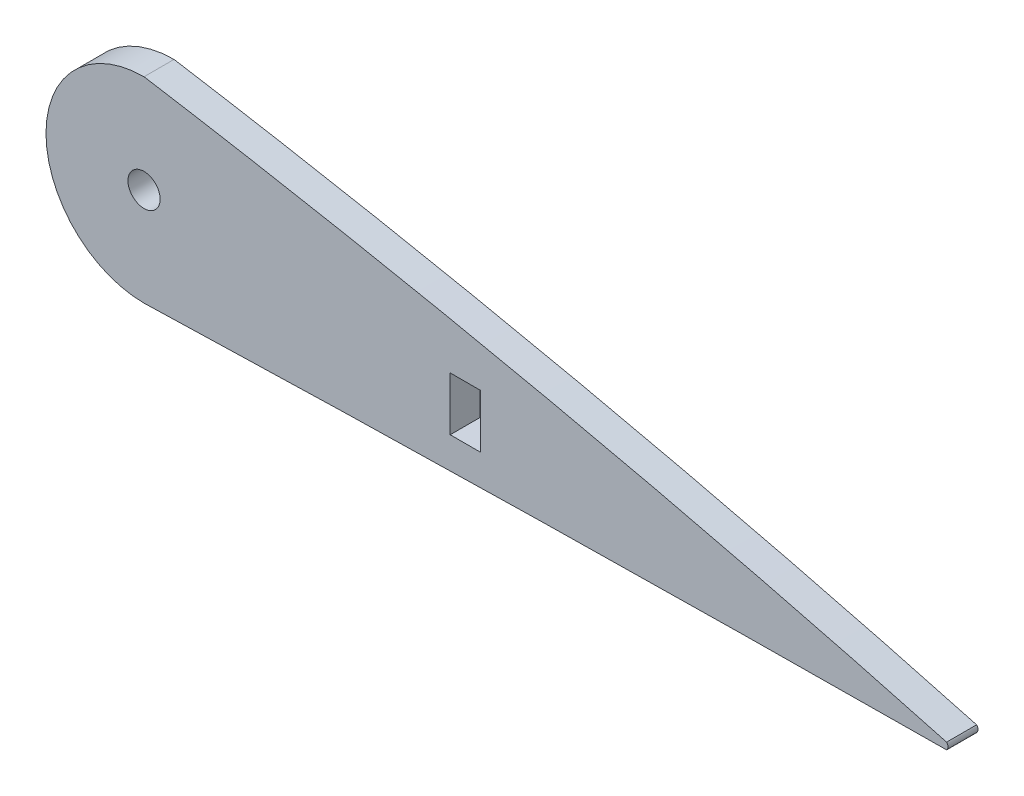
ISO-10303-21;
HEADER;
FILE_DESCRIPTION(('STEP AP214'),'2;1');
FILE_NAME('part.step','',(''),(''),'','','');
FILE_SCHEMA(('AUTOMOTIVE_DESIGN { 1 0 10303 214 1 1 1 1 }'));
ENDSEC;
DATA;
#1=APPLICATION_CONTEXT('core data for automotive mechanical design processes');
#2=APPLICATION_PROTOCOL_DEFINITION('international standard','automotive_design',2000,#1);
#3=PRODUCT_CONTEXT('',#1,'mechanical');
#4=PRODUCT('Part','Part','',(#3));
#5=PRODUCT_RELATED_PRODUCT_CATEGORY('part','',(#4));
#6=PRODUCT_DEFINITION_FORMATION('','',#4);
#7=PRODUCT_DEFINITION_CONTEXT('part definition',#1,'design');
#8=PRODUCT_DEFINITION('design','',#6,#7);
#9=PRODUCT_DEFINITION_SHAPE('','',#8);
#10=(LENGTH_UNIT() NAMED_UNIT(*) SI_UNIT(.MILLI.,.METRE.));
#11=(NAMED_UNIT(*) PLANE_ANGLE_UNIT() SI_UNIT($,.RADIAN.));
#12=(NAMED_UNIT(*) SI_UNIT($,.STERADIAN.) SOLID_ANGLE_UNIT());
#13=UNCERTAINTY_MEASURE_WITH_UNIT(LENGTH_MEASURE(1.E-05),#10,'distance_accuracy_value','');
#14=(GEOMETRIC_REPRESENTATION_CONTEXT(3) GLOBAL_UNCERTAINTY_ASSIGNED_CONTEXT((#13)) GLOBAL_UNIT_ASSIGNED_CONTEXT((#10,
#11,#12)) REPRESENTATION_CONTEXT('',''));
#15=CARTESIAN_POINT('',(0.,0.,0.));
#16=DIRECTION('',(0.,0.,1.));
#17=DIRECTION('',(1.,0.,0.));
#18=AXIS2_PLACEMENT_3D('',#15,#16,#17);
#19=CARTESIAN_POINT('',(249.685,0.,1.4));
#20=DIRECTION('',(0.,0.,-1.));
#21=DIRECTION('',(-1.,0.,0.));
#22=AXIS2_PLACEMENT_3D('',#19,#20,#21);
#23=CYLINDRICAL_SURFACE('',#22,0.445477272147512);
#24=CARTESIAN_POINT('',(249.685,0.,-1.4));
#25=DIRECTION('',(0.,0.,1.));
#26=DIRECTION('',(1.,0.,0.));
#27=AXIS2_PLACEMENT_3D('',#24,#25,#26);
#28=CIRCLE('',#27,0.445477272147512);
#29=CARTESIAN_POINT('',(250.,0.315,-1.4));
#30=VERTEX_POINT('',#29);
#31=CARTESIAN_POINT('',(250.,-0.315,-1.4));
#32=VERTEX_POINT('',#31);
#33=EDGE_CURVE('E209',#30,#32,#28,.F.);
#34=ORIENTED_EDGE('',*,*,#33,.F.);
#35=DIRECTION('',(0.,0.,-1.));
#36=VECTOR('',#35,1.);
#37=CARTESIAN_POINT('',(250.,0.315,1.4));
#38=LINE('',#37,#36);
#39=CARTESIAN_POINT('',(250.,0.315,1.4));
#40=VERTEX_POINT('',#39);
#41=EDGE_CURVE('E11',#40,#30,#38,.T.);
#42=ORIENTED_EDGE('',*,*,#41,.F.);
#43=CARTESIAN_POINT('',(249.685,0.,1.4));
#44=DIRECTION('',(0.,0.,1.));
#45=DIRECTION('',(1.,0.,0.));
#46=AXIS2_PLACEMENT_3D('',#43,#44,#45);
#47=CIRCLE('',#46,0.445477272147512);
#48=CARTESIAN_POINT('',(250.,-0.315,1.4));
#49=VERTEX_POINT('',#48);
#50=EDGE_CURVE('E122',#40,#49,#47,.F.);
#51=ORIENTED_EDGE('',*,*,#50,.T.);
#52=DIRECTION('',(0.,0.,-1.));
#53=VECTOR('',#52,1.);
#54=CARTESIAN_POINT('',(250.,-0.315,1.4));
#55=LINE('',#54,#53);
#56=EDGE_CURVE('E95',#49,#32,#55,.T.);
#57=ORIENTED_EDGE('',*,*,#56,.T.);
#58=EDGE_LOOP('',(#34,#42,#51,#57));
#59=FACE_BOUND('',#58,.T.);
#60=ADVANCED_FACE('F41',(#59),#23,.T.);
#61=CARTESIAN_POINT('',(250.,0.315,1.4));
#62=CARTESIAN_POINT('',(249.1556677398,0.545019817836279,1.4));
#63=CARTESIAN_POINT('',(246.72017569763,1.20851624251313,1.4));
#64=CARTESIAN_POINT('',(242.39133208333,2.35833905261626,1.4));
#65=CARTESIAN_POINT('',(236.8497612043,3.78762536446423,1.4));
#66=CARTESIAN_POINT('',(230.779918279366,5.29800883725429,1.4));
#67=CARTESIAN_POINT('',(224.455917947462,6.81286602762795,1.4));
#68=CARTESIAN_POINT('',(218.030543495663,8.2916106324586,1.4));
#69=CARTESIAN_POINT('',(211.562405044606,9.71973505661334,1.4));
#70=CARTESIAN_POINT('',(205.072411508973,11.0923749324442,1.4));
#71=CARTESIAN_POINT('',(198.567970912658,12.4078507263971,1.4));
#72=CARTESIAN_POINT('',(192.05236991352,13.6652979238497,1.4));
#73=CARTESIAN_POINT('',(185.527619972818,14.8640933031022,1.4));
#74=CARTESIAN_POINT('',(178.995338991115,16.0034047787228,1.4));
#75=CARTESIAN_POINT('',(172.457064741278,17.0823881152075,1.4));
#76=CARTESIAN_POINT('',(165.914317094847,18.0998278411168,1.4));
#77=CARTESIAN_POINT('',(159.368680729007,19.0545018148018,1.4));
#78=CARTESIAN_POINT('',(152.821805127969,19.9448856028229,1.4));
#79=CARTESIAN_POINT('',(146.275439401362,20.76928218283,1.4));
#80=CARTESIAN_POINT('',(139.731359791294,21.5256761133202,1.4));
#81=CARTESIAN_POINT('',(133.191836730309,22.2120042488889,1.4));
#82=CARTESIAN_POINT('',(126.658683026114,22.8257214286805,1.4));
#83=CARTESIAN_POINT('',(120.136770918309,23.363973266088,1.4));
#84=CARTESIAN_POINT('',(113.628567140501,23.8246773240715,1.4));
#85=CARTESIAN_POINT('',(107.152732037453,24.2002425936989,1.4));
#86=CARTESIAN_POINT('',(100.741095692949,24.4983995100481,1.4));
#87=CARTESIAN_POINT('',(94.4117527148801,24.6866497684384,1.4));
#88=CARTESIAN_POINT('',(88.1559179929208,24.7400956502598,1.4));
#89=CARTESIAN_POINT('',(81.9490430552625,24.658849143563,1.4));
#90=CARTESIAN_POINT('',(75.7805205915729,24.4410138083138,1.4));
#91=CARTESIAN_POINT('',(69.653692942001,24.0818848206021,1.4));
#92=CARTESIAN_POINT('',(63.5754105017725,23.5780063609574,1.4));
#93=CARTESIAN_POINT('',(57.5551895509689,22.9249466580897,1.4));
#94=CARTESIAN_POINT('',(51.6057626883655,22.1190655216041,1.4));
#95=CARTESIAN_POINT('',(45.7444003114454,21.1565644320825,1.4));
#96=CARTESIAN_POINT('',(39.9958575941734,20.035371389506,1.4));
#97=CARTESIAN_POINT('',(34.397919842374,18.756316234168,1.4));
#98=CARTESIAN_POINT('',(29.0103821035244,17.327615607561,1.4));
#99=CARTESIAN_POINT('',(23.9257984082512,15.7718649214876,1.4));
#100=CARTESIAN_POINT('',(19.2706788398757,14.1342694339559,1.4));
#101=CARTESIAN_POINT('',(15.1790983912921,12.4833354375465,1.4));
#102=CARTESIAN_POINT('',(11.7404757900967,10.8956109948061,1.4));
#103=CARTESIAN_POINT('',(8.95937186897629,9.42957736532332,1.4));
#104=CARTESIAN_POINT('',(6.76089118010329,8.10860319940964,1.4));
#105=CARTESIAN_POINT('',(5.03370974806799,6.92463805475642,1.4));
#106=CARTESIAN_POINT('',(3.67169493343308,5.85422966432144,1.4));
#107=CARTESIAN_POINT('',(2.59210112319415,4.87130536863603,1.4));
#108=CARTESIAN_POINT('',(1.73817566850273,3.95259574329487,1.4));
#109=CARTESIAN_POINT('',(1.06987082981603,3.08094637334676,1.4));
#110=CARTESIAN_POINT('',(0.571645410381898,2.24162210227498,1.4));
#111=CARTESIAN_POINT('',(0.215773898828885,1.43078539700941,1.4));
#112=CARTESIAN_POINT('',(0.102255581551055,0.88324169451159,1.4));
#113=CARTESIAN_POINT('',(0.047975,0.621425,1.4));
#114=B_SPLINE_CURVE_WITH_KNOTS('',3,(#61,#62,#63,#64,#65,#66,#67,#68,#69,#70,#71,#72,#73,#74,
#75,#76,#77,#78,#79,#80,#81,#82,#83,#84,#85,#86,#87,#88,#89,#90,#91,#92,#93,#94,#95,#96,#97,#98,
#99,#100,#101,#102,#103,#104,#105,#106,#107,#108,#109,#110,#111,#112,#113),.UNSPECIFIED.,.F.,
.F.,(4,1,1,1,1,1,1,1,1,1,1,1,1,1,1,1,1,1,1,1,1,1,1,1,1,1,1,1,1,1,1,1,1,1,1,1,1,1,1,1,1,1,1,1,1,
1,1,1,1,1,4),(0.,0.0101621996718152,0.029313053164405,0.0520116049167946,0.0766194676467142,
0.101948061207292,0.127526131749972,0.153184130655642,0.178867887696566,0.204557902716051,
0.230245711588722,0.255925967287604,0.281594302232909,0.307246419826604,0.332878041533464,
0.358484538095463,0.384061185999046,0.409602822472883,0.435103874040524,0.460559416336008,
0.485959195382529,0.511303069995141,0.53655151535457,0.561723365940153,0.586628866723787,
0.611085431247163,0.63525120042125,0.659272175841394,0.683163753229342,0.706922144180534,
0.730535909866309,0.753983199646257,0.777234690063445,0.800246382303428,0.822950708941546,
0.845237155368769,0.866915895838024,0.887662334604257,0.906968280539555,0.924203157053238,
0.938878974509372,0.95093161065299,0.960693484285195,0.968646729467272,0.975232933115936,
0.980794743901537,0.985583761312909,0.989781538836832,0.99352131251264,0.996902112954681,1.),.UNSPECIFIED.);
#115=DIRECTION('',(0.,0.,-1.));
#116=VECTOR('',#115,1.);
#117=SURFACE_OF_LINEAR_EXTRUSION('',#114,#116);
#118=CARTESIAN_POINT('',(250.,0.315,-1.4));
#119=CARTESIAN_POINT('',(249.1556677398,0.545019817836279,-1.4));
#120=CARTESIAN_POINT('',(246.72017569763,1.20851624251313,-1.4));
#121=CARTESIAN_POINT('',(242.39133208333,2.35833905261626,-1.4));
#122=CARTESIAN_POINT('',(236.8497612043,3.78762536446423,-1.4));
#123=CARTESIAN_POINT('',(230.779918279366,5.29800883725429,-1.4));
#124=CARTESIAN_POINT('',(224.455917947462,6.81286602762795,-1.4));
#125=CARTESIAN_POINT('',(218.030543495663,8.2916106324586,-1.4));
#126=CARTESIAN_POINT('',(211.562405044606,9.71973505661334,-1.4));
#127=CARTESIAN_POINT('',(205.072411508973,11.0923749324442,-1.4));
#128=CARTESIAN_POINT('',(198.567970912658,12.4078507263971,-1.4));
#129=CARTESIAN_POINT('',(192.05236991352,13.6652979238497,-1.4));
#130=CARTESIAN_POINT('',(185.527619972818,14.8640933031022,-1.4));
#131=CARTESIAN_POINT('',(178.995338991115,16.0034047787228,-1.4));
#132=CARTESIAN_POINT('',(172.457064741278,17.0823881152075,-1.4));
#133=CARTESIAN_POINT('',(165.914317094847,18.0998278411168,-1.4));
#134=CARTESIAN_POINT('',(159.368680729007,19.0545018148018,-1.4));
#135=CARTESIAN_POINT('',(152.821805127969,19.9448856028229,-1.4));
#136=CARTESIAN_POINT('',(146.275439401362,20.76928218283,-1.4));
#137=CARTESIAN_POINT('',(139.731359791294,21.5256761133202,-1.4));
#138=CARTESIAN_POINT('',(133.191836730309,22.2120042488889,-1.4));
#139=CARTESIAN_POINT('',(126.658683026114,22.8257214286805,-1.4));
#140=CARTESIAN_POINT('',(120.136770918309,23.363973266088,-1.4));
#141=CARTESIAN_POINT('',(113.628567140501,23.8246773240715,-1.4));
#142=CARTESIAN_POINT('',(107.152732037453,24.2002425936989,-1.4));
#143=CARTESIAN_POINT('',(100.741095692949,24.4983995100481,-1.4));
#144=CARTESIAN_POINT('',(94.4117527148801,24.6866497684384,-1.4));
#145=CARTESIAN_POINT('',(88.1559179929208,24.7400956502598,-1.4));
#146=CARTESIAN_POINT('',(81.9490430552625,24.658849143563,-1.4));
#147=CARTESIAN_POINT('',(75.7805205915729,24.4410138083138,-1.4));
#148=CARTESIAN_POINT('',(69.653692942001,24.0818848206021,-1.4));
#149=CARTESIAN_POINT('',(63.5754105017725,23.5780063609574,-1.4));
#150=CARTESIAN_POINT('',(57.5551895509689,22.9249466580897,-1.4));
#151=CARTESIAN_POINT('',(51.6057626883655,22.1190655216041,-1.4));
#152=CARTESIAN_POINT('',(45.7444003114454,21.1565644320825,-1.4));
#153=CARTESIAN_POINT('',(39.9958575941734,20.035371389506,-1.4));
#154=CARTESIAN_POINT('',(34.397919842374,18.756316234168,-1.4));
#155=CARTESIAN_POINT('',(29.0103821035244,17.327615607561,-1.4));
#156=CARTESIAN_POINT('',(23.9257984082512,15.7718649214876,-1.4));
#157=CARTESIAN_POINT('',(19.2706788398757,14.1342694339559,-1.4));
#158=CARTESIAN_POINT('',(15.1790983912921,12.4833354375465,-1.4));
#159=CARTESIAN_POINT('',(11.7404757900967,10.8956109948061,-1.4));
#160=CARTESIAN_POINT('',(8.95937186897629,9.42957736532332,-1.4));
#161=CARTESIAN_POINT('',(6.76089118010329,8.10860319940964,-1.4));
#162=CARTESIAN_POINT('',(5.03370974806799,6.92463805475642,-1.4));
#163=CARTESIAN_POINT('',(3.67169493343308,5.85422966432144,-1.4));
#164=CARTESIAN_POINT('',(2.59210112319415,4.87130536863603,-1.4));
#165=CARTESIAN_POINT('',(1.73817566850273,3.95259574329487,-1.4));
#166=CARTESIAN_POINT('',(1.06987082981603,3.08094637334676,-1.4));
#167=CARTESIAN_POINT('',(0.571645410381898,2.24162210227498,-1.4));
#168=CARTESIAN_POINT('',(0.215773898828885,1.43078539700941,-1.4));
#169=CARTESIAN_POINT('',(0.102255581551055,0.88324169451159,-1.4));
#170=CARTESIAN_POINT('',(0.047975,0.621425,-1.4));
#171=B_SPLINE_CURVE_WITH_KNOTS('',3,(#118,#119,#120,#121,#122,#123,#124,#125,#126,#127,#128,
#129,#130,#131,#132,#133,#134,#135,#136,#137,#138,#139,#140,#141,#142,#143,#144,#145,#146,#147,
#148,#149,#150,#151,#152,#153,#154,#155,#156,#157,#158,#159,#160,#161,#162,#163,#164,#165,#166,
#167,#168,#169,#170),.UNSPECIFIED.,.F.,.F.,(4,1,1,1,1,1,1,1,1,1,1,1,1,1,1,1,1,1,1,1,1,1,1,1,1,1,
1,1,1,1,1,1,1,1,1,1,1,1,1,1,1,1,1,1,1,1,1,1,1,1,4),(0.,0.0101621996718152,0.029313053164405,
0.0520116049167946,0.0766194676467142,0.101948061207292,0.127526131749972,0.153184130655642,
0.178867887696566,0.204557902716051,0.230245711588722,0.255925967287604,0.281594302232909,
0.307246419826604,0.332878041533464,0.358484538095463,0.384061185999046,0.409602822472883,
0.435103874040524,0.460559416336008,0.485959195382529,0.511303069995141,0.53655151535457,
0.561723365940153,0.586628866723787,0.611085431247163,0.63525120042125,0.659272175841394,
0.683163753229342,0.706922144180534,0.730535909866309,0.753983199646257,0.777234690063445,
0.800246382303428,0.822950708941546,0.845237155368769,0.866915895838024,0.887662334604257,
0.906968280539555,0.924203157053238,0.938878974509372,0.95093161065299,0.960693484285195,
0.968646729467272,0.975232933115936,0.980794743901537,0.985583761312909,0.989781538836832,
0.99352131251264,0.996902112954681,1.),.UNSPECIFIED.);
#172=CARTESIAN_POINT('',(175.091334090503,16.6447875148628,-1.4));
#173=VERTEX_POINT('',#172);
#174=EDGE_CURVE('E129',#30,#173,#171,.T.);
#175=ORIENTED_EDGE('',*,*,#174,.T.);
#176=DIRECTION('',(0.,0.,-1.));
#177=VECTOR('',#176,1.);
#178=CARTESIAN_POINT('',(175.091334090503,16.6447875148628,1.4));
#179=LINE('',#178,#177);
#180=CARTESIAN_POINT('',(175.091334090503,16.6447875148628,1.4));
#181=VERTEX_POINT('',#180);
#182=EDGE_CURVE('E52',#181,#173,#179,.T.);
#183=ORIENTED_EDGE('',*,*,#182,.F.);
#184=EDGE_CURVE('E117',#40,#181,#114,.T.);
#185=ORIENTED_EDGE('',*,*,#184,.F.);
#186=ORIENTED_EDGE('',*,*,#41,.T.);
#187=EDGE_LOOP('',(#175,#183,#185,#186));
#188=FACE_BOUND('',#187,.T.);
#189=ADVANCED_FACE('F127',(#188),#117,.F.);
#190=CARTESIAN_POINT('',(175.091334090503,7.49391035659057,1.4));
#191=DIRECTION('',(0.,0.,-1.));
#192=DIRECTION('',(-1.,0.,0.));
#193=AXIS2_PLACEMENT_3D('',#190,#191,#192);
#194=CYLINDRICAL_SURFACE('',#193,9.15087715827226);
#195=CARTESIAN_POINT('',(175.091334090503,7.49391035659057,-1.4));
#196=DIRECTION('',(0.,0.,1.));
#197=DIRECTION('',(1.,0.,0.));
#198=AXIS2_PLACEMENT_3D('',#195,#196,#197);
#199=CIRCLE('',#198,9.15087715827226);
#200=CARTESIAN_POINT('',(175.091334090503,-1.65696680168169,-1.4));
#201=VERTEX_POINT('',#200);
#202=EDGE_CURVE('E217',#201,#173,#199,.F.);
#203=ORIENTED_EDGE('',*,*,#202,.F.);
#204=DIRECTION('',(0.,0.,-1.));
#205=VECTOR('',#204,1.);
#206=CARTESIAN_POINT('',(175.091334090503,-1.65696680168169,1.4));
#207=LINE('',#206,#205);
#208=CARTESIAN_POINT('',(175.091334090503,-1.65696680168169,1.4));
#209=VERTEX_POINT('',#208);
#210=EDGE_CURVE('E88',#209,#201,#207,.T.);
#211=ORIENTED_EDGE('',*,*,#210,.F.);
#212=CARTESIAN_POINT('',(175.091334090503,7.49391035659057,1.4));
#213=DIRECTION('',(0.,0.,1.));
#214=DIRECTION('',(1.,0.,0.));
#215=AXIS2_PLACEMENT_3D('',#212,#213,#214);
#216=CIRCLE('',#215,9.15087715827226);
#217=EDGE_CURVE('E121',#209,#181,#216,.F.);
#218=ORIENTED_EDGE('',*,*,#217,.T.);
#219=ORIENTED_EDGE('',*,*,#182,.T.);
#220=EDGE_LOOP('',(#203,#211,#218,#219));
#221=FACE_BOUND('',#220,.T.);
#222=ADVANCED_FACE('F135',(#221),#194,.T.);
#223=CARTESIAN_POINT('',(0.,6.99391035659057,1.4));
#224=DIRECTION('',(0.,1.,0.));
#225=DIRECTION('',(0.,0.,1.));
#226=AXIS2_PLACEMENT_3D('',#223,#224,#225);
#227=PLANE('',#226);
#228=DIRECTION('',(1.,0.,0.));
#229=VECTOR('',#228,1.);
#230=CARTESIAN_POINT('',(0.,6.99391035659057,-1.4));
#231=LINE('',#230,#229);
#232=CARTESIAN_POINT('',(203.666334090503,6.99391035659057,-1.4));
#233=VERTEX_POINT('',#232);
#234=CARTESIAN_POINT('',(206.516334090503,6.99391035659057,-1.4));
#235=VERTEX_POINT('',#234);
#236=EDGE_CURVE('E149',#233,#235,#231,.T.);
#237=ORIENTED_EDGE('',*,*,#236,.T.);
#238=DIRECTION('',(0.,0.,-1.));
#239=VECTOR('',#238,1.);
#240=CARTESIAN_POINT('',(206.516334090503,6.99391035659057,1.4));
#241=LINE('',#240,#239);
#242=CARTESIAN_POINT('',(206.516334090503,6.99391035659057,1.4));
#243=VERTEX_POINT('',#242);
#244=EDGE_CURVE('E45',#243,#235,#241,.T.);
#245=ORIENTED_EDGE('',*,*,#244,.F.);
#246=DIRECTION('',(1.,0.,0.));
#247=VECTOR('',#246,1.);
#248=CARTESIAN_POINT('',(0.,6.99391035659057,1.4));
#249=LINE('',#248,#247);
#250=CARTESIAN_POINT('',(203.666334090503,6.99391035659057,1.4));
#251=VERTEX_POINT('',#250);
#252=EDGE_CURVE('E228',#251,#243,#249,.T.);
#253=ORIENTED_EDGE('',*,*,#252,.F.);
#254=DIRECTION('',(0.,0.,-1.));
#255=VECTOR('',#254,1.);
#256=CARTESIAN_POINT('',(203.666334090503,6.99391035659057,1.4));
#257=LINE('',#256,#255);
#258=EDGE_CURVE('E139',#251,#233,#257,.T.);
#259=ORIENTED_EDGE('',*,*,#258,.T.);
#260=EDGE_LOOP('',(#237,#245,#253,#259));
#261=FACE_BOUND('',#260,.T.);
#262=ADVANCED_FACE('F43',(#261),#227,.F.);
#263=CARTESIAN_POINT('',(206.516334090503,0.,1.4));
#264=DIRECTION('',(1.,0.,0.));
#265=DIRECTION('',(0.,0.,-1.));
#266=AXIS2_PLACEMENT_3D('',#263,#264,#265);
#267=PLANE('',#266);
#268=DIRECTION('',(0.,-1.,0.));
#269=VECTOR('',#268,1.);
#270=CARTESIAN_POINT('',(206.516334090503,0.,-1.4));
#271=LINE('',#270,#269);
#272=CARTESIAN_POINT('',(206.516334090503,1.99391035659057,-1.4));
#273=VERTEX_POINT('',#272);
#274=EDGE_CURVE('E185',#235,#273,#271,.T.);
#275=ORIENTED_EDGE('',*,*,#274,.T.);
#276=DIRECTION('',(0.,0.,-1.));
#277=VECTOR('',#276,1.);
#278=CARTESIAN_POINT('',(206.516334090503,1.99391035659057,1.4));
#279=LINE('',#278,#277);
#280=CARTESIAN_POINT('',(206.516334090503,1.99391035659057,1.4));
#281=VERTEX_POINT('',#280);
#282=EDGE_CURVE('E187',#281,#273,#279,.T.);
#283=ORIENTED_EDGE('',*,*,#282,.F.);
#284=DIRECTION('',(0.,-1.,0.));
#285=VECTOR('',#284,1.);
#286=CARTESIAN_POINT('',(206.516334090503,0.,1.4));
#287=LINE('',#286,#285);
#288=EDGE_CURVE('E103',#243,#281,#287,.T.);
#289=ORIENTED_EDGE('',*,*,#288,.F.);
#290=ORIENTED_EDGE('',*,*,#244,.T.);
#291=EDGE_LOOP('',(#275,#283,#289,#290));
#292=FACE_BOUND('',#291,.T.);
#293=ADVANCED_FACE('F177',(#292),#267,.F.);
#294=CARTESIAN_POINT('',(0.,1.9939103565906,1.4));
#295=DIRECTION('',(0.,1.,0.));
#296=DIRECTION('',(-1.,0.,0.));
#297=AXIS2_PLACEMENT_3D('',#294,#295,#296);
#298=PLANE('',#297);
#299=DIRECTION('',(1.,0.,0.));
#300=VECTOR('',#299,1.);
#301=CARTESIAN_POINT('',(0.,1.9939103565906,-1.4));
#302=LINE('',#301,#300);
#303=CARTESIAN_POINT('',(203.666334090503,1.99391035659057,-1.4));
#304=VERTEX_POINT('',#303);
#305=EDGE_CURVE('E194',#304,#273,#302,.T.);
#306=ORIENTED_EDGE('',*,*,#305,.F.);
#307=DIRECTION('',(0.,0.,-1.));
#308=VECTOR('',#307,1.);
#309=CARTESIAN_POINT('',(203.666334090503,1.99391035659057,1.4));
#310=LINE('',#309,#308);
#311=CARTESIAN_POINT('',(203.666334090503,1.99391035659057,1.4));
#312=VERTEX_POINT('',#311);
#313=EDGE_CURVE('E238',#312,#304,#310,.T.);
#314=ORIENTED_EDGE('',*,*,#313,.F.);
#315=DIRECTION('',(1.,0.,0.));
#316=VECTOR('',#315,1.);
#317=CARTESIAN_POINT('',(0.,1.9939103565906,1.4));
#318=LINE('',#317,#316);
#319=EDGE_CURVE('E243',#312,#281,#318,.T.);
#320=ORIENTED_EDGE('',*,*,#319,.T.);
#321=ORIENTED_EDGE('',*,*,#282,.T.);
#322=EDGE_LOOP('',(#306,#314,#320,#321));
#323=FACE_BOUND('',#322,.T.);
#324=ADVANCED_FACE('F171',(#323),#298,.T.);
#325=CARTESIAN_POINT('',(175.091334090503,7.49391035659057,1.4));
#326=DIRECTION('',(0.,0.,-1.));
#327=DIRECTION('',(-1.,0.,0.));
#328=AXIS2_PLACEMENT_3D('',#325,#326,#327);
#329=CYLINDRICAL_SURFACE('',#328,1.5);
#330=CARTESIAN_POINT('',(175.091334090503,7.49391035659057,1.4));
#331=DIRECTION('',(0.,0.,1.));
#332=DIRECTION('',(1.,0.,0.));
#333=AXIS2_PLACEMENT_3D('',#330,#331,#332);
#334=CIRCLE('',#333,1.5);
#335=CARTESIAN_POINT('',(176.591334090503,7.49391035659057,1.4));
#336=VERTEX_POINT('',#335);
#337=EDGE_CURVE('E252',#336,#336,#334,.T.);
#338=ORIENTED_EDGE('',*,*,#337,.T.);
#339=EDGE_LOOP('',(#338));
#340=FACE_BOUND('',#339,.T.);
#341=CARTESIAN_POINT('',(175.091334090503,7.49391035659057,-1.4));
#342=DIRECTION('',(0.,0.,1.));
#343=DIRECTION('',(1.,0.,0.));
#344=AXIS2_PLACEMENT_3D('',#341,#342,#343);
#345=CIRCLE('',#344,1.5);
#346=CARTESIAN_POINT('',(176.591334090503,7.49391035659057,-1.4));
#347=VERTEX_POINT('',#346);
#348=EDGE_CURVE('E203',#347,#347,#345,.T.);
#349=ORIENTED_EDGE('',*,*,#348,.F.);
#350=EDGE_LOOP('',(#349));
#351=FACE_BOUND('',#350,.T.);
#352=ADVANCED_FACE('F168',(#340,#351),#329,.F.);
#353=CARTESIAN_POINT('',(203.666334090503,0.,1.4));
#354=DIRECTION('',(1.,0.,0.));
#355=DIRECTION('',(0.,0.,-1.));
#356=AXIS2_PLACEMENT_3D('',#353,#354,#355);
#357=PLANE('',#356);
#358=DIRECTION('',(0.,-1.,0.));
#359=VECTOR('',#358,1.);
#360=CARTESIAN_POINT('',(203.666334090503,0.,-1.4));
#361=LINE('',#360,#359);
#362=EDGE_CURVE('E199',#233,#304,#361,.T.);
#363=ORIENTED_EDGE('',*,*,#362,.F.);
#364=ORIENTED_EDGE('',*,*,#258,.F.);
#365=DIRECTION('',(0.,-1.,0.));
#366=VECTOR('',#365,1.);
#367=CARTESIAN_POINT('',(203.666334090503,0.,1.4));
#368=LINE('',#367,#366);
#369=EDGE_CURVE('E248',#251,#312,#368,.T.);
#370=ORIENTED_EDGE('',*,*,#369,.T.);
#371=ORIENTED_EDGE('',*,*,#313,.T.);
#372=EDGE_LOOP('',(#363,#364,#370,#371));
#373=FACE_BOUND('',#372,.T.);
#374=ADVANCED_FACE('F159',(#373),#357,.T.);
#375=CARTESIAN_POINT('',(0.047975,0.621425,1.4));
#376=CARTESIAN_POINT('',(0.0227138203276048,0.373490085622791,1.4));
#377=CARTESIAN_POINT('',(-0.0278207890067418,-0.122499975050766,1.4));
#378=CARTESIAN_POINT('',(0.0779912124025658,-0.884434590165201,1.4));
#379=CARTESIAN_POINT('',(0.349695650479558,-1.63883807038276,1.4));
#380=CARTESIAN_POINT('',(0.814331135146287,-2.36506892355371,1.4));
#381=CARTESIAN_POINT('',(1.46348078042047,-3.03927524464629,1.4));
#382=CARTESIAN_POINT('',(2.29097301668935,-3.66099946963366,1.4));
#383=CARTESIAN_POINT('',(3.30592875031006,-4.23577962104374,1.4));
#384=CARTESIAN_POINT('',(4.53525561919462,-4.77367414359886,1.4));
#385=CARTESIAN_POINT('',(6.02974568831117,-5.28219216459101,1.4));
#386=CARTESIAN_POINT('',(7.86898121528962,-5.76531667645348,1.4));
#387=CARTESIAN_POINT('',(10.1688313918654,-6.22171659288376,1.4));
#388=CARTESIAN_POINT('',(13.0754381888996,-6.63961873115542,1.4));
#389=CARTESIAN_POINT('',(16.7281153626706,-6.9929567376365,1.4));
#390=CARTESIAN_POINT('',(21.1899520960701,-7.24734514465608,1.4));
#391=CARTESIAN_POINT('',(26.3999844156156,-7.37663884892169,1.4));
#392=CARTESIAN_POINT('',(32.1973985639414,-7.3762569130408,1.4));
#393=CARTESIAN_POINT('',(38.3978067590662,-7.26143657976799,1.4));
#394=CARTESIAN_POINT('',(44.8576217679783,-7.05664135813184,1.4));
#395=CARTESIAN_POINT('',(51.4865430961494,-6.78645353187047,1.4));
#396=CARTESIAN_POINT('',(58.2309809321351,-6.47232458681409,1.4));
#397=CARTESIAN_POINT('',(65.0520946060131,-6.13285226454697,1.4));
#398=CARTESIAN_POINT('',(71.9107727092338,-5.78400517676069,1.4));
#399=CARTESIAN_POINT('',(78.7713755761997,-5.43968045365919,1.4));
#400=CARTESIAN_POINT('',(85.6104986098046,-5.1109512525955,1.4));
#401=CARTESIAN_POINT('',(92.4321075899298,-4.80495332575523,1.4));
#402=CARTESIAN_POINT('',(99.2550311901141,-4.53198165486052,1.4));
#403=CARTESIAN_POINT('',(106.097378404906,-4.2782746709768,1.4));
#404=CARTESIAN_POINT('',(112.96921168025,-4.00308992595863,1.4));
#405=CARTESIAN_POINT('',(119.864404254545,-3.72317618427209,1.4));
#406=CARTESIAN_POINT('',(126.773860473488,-3.44006729642004,1.4));
#407=CARTESIAN_POINT('',(133.681563213165,-3.15869560044929,1.4));
#408=CARTESIAN_POINT('',(140.581870407101,-2.88238072043892,1.4));
#409=CARTESIAN_POINT('',(147.472013761627,-2.6139229582865,1.4));
#410=CARTESIAN_POINT('',(154.352602410646,-2.35562641484789,1.4));
#411=CARTESIAN_POINT('',(161.225044134142,-2.10936992107383,1.4));
#412=CARTESIAN_POINT('',(168.090869746121,-1.87663407429386,1.4));
#413=CARTESIAN_POINT('',(174.951578521953,-1.65864310401416,1.4));
#414=CARTESIAN_POINT('',(181.808595965615,-1.45637812303537,1.4));
#415=CARTESIAN_POINT('',(188.663234462377,-1.27038337720763,1.4));
#416=CARTESIAN_POINT('',(195.516645167653,-1.10111288413947,1.4));
#417=CARTESIAN_POINT('',(202.369532893738,-0.948617188746303,1.4));
#418=CARTESIAN_POINT('',(211.499190290366,-0.767742353448254,1.4));
#419=CARTESIAN_POINT('',(220.6030986659,-0.619939742232208,1.4));
#420=CARTESIAN_POINT('',(229.617630172189,-0.502926179992112,1.4));
#421=CARTESIAN_POINT('',(236.087353853958,-0.431514191705789,1.4));
#422=CARTESIAN_POINT('',(241.980776912644,-0.376520461448702,1.4));
#423=CARTESIAN_POINT('',(246.558970010782,-0.339535885915444,1.4));
#424=CARTESIAN_POINT('',(249.120490964528,-0.321271242454606,1.4));
#425=CARTESIAN_POINT('',(250.,-0.315,1.4));
#426=B_SPLINE_CURVE_WITH_KNOTS('',3,(#375,#376,#377,#378,#379,#380,#381,#382,#383,#384,#385,
#386,#387,#388,#389,#390,#391,#392,#393,#394,#395,#396,#397,#398,#399,#400,#401,#402,#403,#404,
#405,#406,#407,#408,#409,#410,#411,#412,#413,#414,#415,#416,#417,#418,#419,#420,#421,#422,#423,
#424,#425),.UNSPECIFIED.,.F.,.F.,(4,1,1,1,1,1,1,1,1,1,1,1,1,1,1,1,1,1,1,1,1,1,1,1,1,1,1,1,1,1,1,
1,1,1,1,1,1,1,1,1,1,1,1,1,1,1,1,1,4),(0.,0.00294144629716841,0.00588431899986843,
0.00901612990907169,0.0123645467308032,0.0160079338878462,0.0200368451305784,0.0245737277973679,
0.029783834741521,0.0358970100073663,0.043240439578336,0.0522759653413005,0.0636345893302709,
0.0779831757705632,0.0956981612833506,0.116520086015495,0.139660730330278,0.164312170171254,
0.189918890388145,0.216157201054431,0.242837761985605,0.269833582781319,0.296993021546457,
0.324123271890544,0.351139106824528,0.378035508721976,0.404946015910257,0.431960836658272,
0.459078394602815,0.486347400324305,0.513640830241323,0.540928594677757,0.568176028038828,
0.595379568955062,0.622543444942076,0.6496732603013,0.676775201241309,0.70385522836994,
0.730918774891245,0.757971338224895,0.785017763038357,0.812061650836912,0.839103366014866,
0.893099151655267,0.919831064622048,0.945809917390178,0.96968060086528,0.989589706283647,1.),.UNSPECIFIED.);
#427=DIRECTION('',(0.,0.,-1.));
#428=VECTOR('',#427,1.);
#429=SURFACE_OF_LINEAR_EXTRUSION('',#426,#428);
#430=CARTESIAN_POINT('',(0.047975,0.621425,-1.4));
#431=CARTESIAN_POINT('',(0.0227138203276048,0.373490085622791,-1.4));
#432=CARTESIAN_POINT('',(-0.0278207890067418,-0.122499975050766,-1.4));
#433=CARTESIAN_POINT('',(0.0779912124025658,-0.884434590165201,-1.4));
#434=CARTESIAN_POINT('',(0.349695650479558,-1.63883807038276,-1.4));
#435=CARTESIAN_POINT('',(0.814331135146287,-2.36506892355371,-1.4));
#436=CARTESIAN_POINT('',(1.46348078042047,-3.03927524464629,-1.4));
#437=CARTESIAN_POINT('',(2.29097301668935,-3.66099946963366,-1.4));
#438=CARTESIAN_POINT('',(3.30592875031006,-4.23577962104374,-1.4));
#439=CARTESIAN_POINT('',(4.53525561919462,-4.77367414359886,-1.4));
#440=CARTESIAN_POINT('',(6.02974568831117,-5.28219216459101,-1.4));
#441=CARTESIAN_POINT('',(7.86898121528962,-5.76531667645348,-1.4));
#442=CARTESIAN_POINT('',(10.1688313918654,-6.22171659288376,-1.4));
#443=CARTESIAN_POINT('',(13.0754381888996,-6.63961873115542,-1.4));
#444=CARTESIAN_POINT('',(16.7281153626706,-6.9929567376365,-1.4));
#445=CARTESIAN_POINT('',(21.1899520960701,-7.24734514465608,-1.4));
#446=CARTESIAN_POINT('',(26.3999844156156,-7.37663884892169,-1.4));
#447=CARTESIAN_POINT('',(32.1973985639414,-7.3762569130408,-1.4));
#448=CARTESIAN_POINT('',(38.3978067590662,-7.26143657976799,-1.4));
#449=CARTESIAN_POINT('',(44.8576217679783,-7.05664135813184,-1.4));
#450=CARTESIAN_POINT('',(51.4865430961494,-6.78645353187047,-1.4));
#451=CARTESIAN_POINT('',(58.2309809321351,-6.47232458681409,-1.4));
#452=CARTESIAN_POINT('',(65.0520946060131,-6.13285226454697,-1.4));
#453=CARTESIAN_POINT('',(71.9107727092338,-5.78400517676069,-1.4));
#454=CARTESIAN_POINT('',(78.7713755761997,-5.43968045365919,-1.4));
#455=CARTESIAN_POINT('',(85.6104986098046,-5.1109512525955,-1.4));
#456=CARTESIAN_POINT('',(92.4321075899298,-4.80495332575523,-1.4));
#457=CARTESIAN_POINT('',(99.2550311901141,-4.53198165486052,-1.4));
#458=CARTESIAN_POINT('',(106.097378404906,-4.2782746709768,-1.4));
#459=CARTESIAN_POINT('',(112.96921168025,-4.00308992595863,-1.4));
#460=CARTESIAN_POINT('',(119.864404254545,-3.72317618427209,-1.4));
#461=CARTESIAN_POINT('',(126.773860473488,-3.44006729642004,-1.4));
#462=CARTESIAN_POINT('',(133.681563213165,-3.15869560044929,-1.4));
#463=CARTESIAN_POINT('',(140.581870407101,-2.88238072043892,-1.4));
#464=CARTESIAN_POINT('',(147.472013761627,-2.6139229582865,-1.4));
#465=CARTESIAN_POINT('',(154.352602410646,-2.35562641484789,-1.4));
#466=CARTESIAN_POINT('',(161.225044134142,-2.10936992107383,-1.4));
#467=CARTESIAN_POINT('',(168.090869746121,-1.87663407429386,-1.4));
#468=CARTESIAN_POINT('',(174.951578521953,-1.65864310401416,-1.4));
#469=CARTESIAN_POINT('',(181.808595965615,-1.45637812303537,-1.4));
#470=CARTESIAN_POINT('',(188.663234462377,-1.27038337720763,-1.4));
#471=CARTESIAN_POINT('',(195.516645167653,-1.10111288413947,-1.4));
#472=CARTESIAN_POINT('',(202.369532893738,-0.948617188746303,-1.4));
#473=CARTESIAN_POINT('',(211.499190290366,-0.767742353448254,-1.4));
#474=CARTESIAN_POINT('',(220.6030986659,-0.619939742232208,-1.4));
#475=CARTESIAN_POINT('',(229.617630172189,-0.502926179992112,-1.4));
#476=CARTESIAN_POINT('',(236.087353853958,-0.431514191705789,-1.4));
#477=CARTESIAN_POINT('',(241.980776912644,-0.376520461448702,-1.4));
#478=CARTESIAN_POINT('',(246.558970010782,-0.339535885915444,-1.4));
#479=CARTESIAN_POINT('',(249.120490964528,-0.321271242454606,-1.4));
#480=CARTESIAN_POINT('',(250.,-0.315,-1.4));
#481=B_SPLINE_CURVE_WITH_KNOTS('',3,(#430,#431,#432,#433,#434,#435,#436,#437,#438,#439,#440,
#441,#442,#443,#444,#445,#446,#447,#448,#449,#450,#451,#452,#453,#454,#455,#456,#457,#458,#459,
#460,#461,#462,#463,#464,#465,#466,#467,#468,#469,#470,#471,#472,#473,#474,#475,#476,#477,#478,
#479,#480),.UNSPECIFIED.,.F.,.F.,(4,1,1,1,1,1,1,1,1,1,1,1,1,1,1,1,1,1,1,1,1,1,1,1,1,1,1,1,1,1,1,
1,1,1,1,1,1,1,1,1,1,1,1,1,1,1,1,1,4),(0.,0.00294144629716841,0.00588431899986843,
0.00901612990907169,0.0123645467308032,0.0160079338878462,0.0200368451305784,0.0245737277973679,
0.029783834741521,0.0358970100073663,0.043240439578336,0.0522759653413005,0.0636345893302709,
0.0779831757705632,0.0956981612833506,0.116520086015495,0.139660730330278,0.164312170171254,
0.189918890388145,0.216157201054431,0.242837761985605,0.269833582781319,0.296993021546457,
0.324123271890544,0.351139106824528,0.378035508721976,0.404946015910257,0.431960836658272,
0.459078394602815,0.486347400324305,0.513640830241323,0.540928594677757,0.568176028038828,
0.595379568955062,0.622543444942076,0.6496732603013,0.676775201241309,0.70385522836994,
0.730918774891245,0.757971338224895,0.785017763038357,0.812061650836912,0.839103366014866,
0.893099151655267,0.919831064622048,0.945809917390178,0.96968060086528,0.989589706283647,1.),.UNSPECIFIED.);
#482=EDGE_CURVE('E223',#201,#32,#481,.T.);
#483=ORIENTED_EDGE('',*,*,#482,.T.);
#484=ORIENTED_EDGE('',*,*,#56,.F.);
#485=EDGE_CURVE('E61',#209,#49,#426,.T.);
#486=ORIENTED_EDGE('',*,*,#485,.F.);
#487=ORIENTED_EDGE('',*,*,#210,.T.);
#488=EDGE_LOOP('',(#483,#484,#486,#487));
#489=FACE_BOUND('',#488,.T.);
#490=ADVANCED_FACE('F155',(#489),#429,.F.);
#491=CARTESIAN_POINT('',(0.,0.,1.4));
#492=DIRECTION('',(0.,0.,1.));
#493=DIRECTION('',(1.,0.,0.));
#494=AXIS2_PLACEMENT_3D('',#491,#492,#493);
#495=PLANE('',#494);
#496=ORIENTED_EDGE('',*,*,#252,.T.);
#497=ORIENTED_EDGE('',*,*,#288,.T.);
#498=ORIENTED_EDGE('',*,*,#319,.F.);
#499=ORIENTED_EDGE('',*,*,#369,.F.);
#500=EDGE_LOOP('',(#496,#497,#498,#499));
#501=FACE_BOUND('',#500,.T.);
#502=ORIENTED_EDGE('',*,*,#337,.F.);
#503=EDGE_LOOP('',(#502));
#504=FACE_BOUND('',#503,.T.);
#505=ORIENTED_EDGE('',*,*,#50,.F.);
#506=ORIENTED_EDGE('',*,*,#184,.T.);
#507=ORIENTED_EDGE('',*,*,#217,.F.);
#508=ORIENTED_EDGE('',*,*,#485,.T.);
#509=EDGE_LOOP('',(#505,#506,#507,#508));
#510=FACE_BOUND('',#509,.T.);
#511=ADVANCED_FACE('F119',(#501,#504,#510),#495,.T.);
#512=CARTESIAN_POINT('',(0.,0.,-1.4));
#513=DIRECTION('',(0.,0.,1.));
#514=DIRECTION('',(1.,0.,0.));
#515=AXIS2_PLACEMENT_3D('',#512,#513,#514);
#516=PLANE('',#515);
#517=ORIENTED_EDGE('',*,*,#236,.F.);
#518=ORIENTED_EDGE('',*,*,#362,.T.);
#519=ORIENTED_EDGE('',*,*,#305,.T.);
#520=ORIENTED_EDGE('',*,*,#274,.F.);
#521=EDGE_LOOP('',(#517,#518,#519,#520));
#522=FACE_BOUND('',#521,.T.);
#523=ORIENTED_EDGE('',*,*,#348,.T.);
#524=EDGE_LOOP('',(#523));
#525=FACE_BOUND('',#524,.T.);
#526=ORIENTED_EDGE('',*,*,#33,.T.);
#527=ORIENTED_EDGE('',*,*,#482,.F.);
#528=ORIENTED_EDGE('',*,*,#202,.T.);
#529=ORIENTED_EDGE('',*,*,#174,.F.);
#530=EDGE_LOOP('',(#526,#527,#528,#529));
#531=FACE_BOUND('',#530,.T.);
#532=ADVANCED_FACE('F160',(#522,#525,#531),#516,.F.);
#533=CLOSED_SHELL('',(#60,#189,#222,#262,#293,#324,#352,#374,#490,#511,#532));
#534=MANIFOLD_SOLID_BREP('B2',#533);
#535=ADVANCED_BREP_SHAPE_REPRESENTATION('',(#18,#534),#14);
#536=SHAPE_DEFINITION_REPRESENTATION(#9,#535);
ENDSEC;
END-ISO-10303-21;
